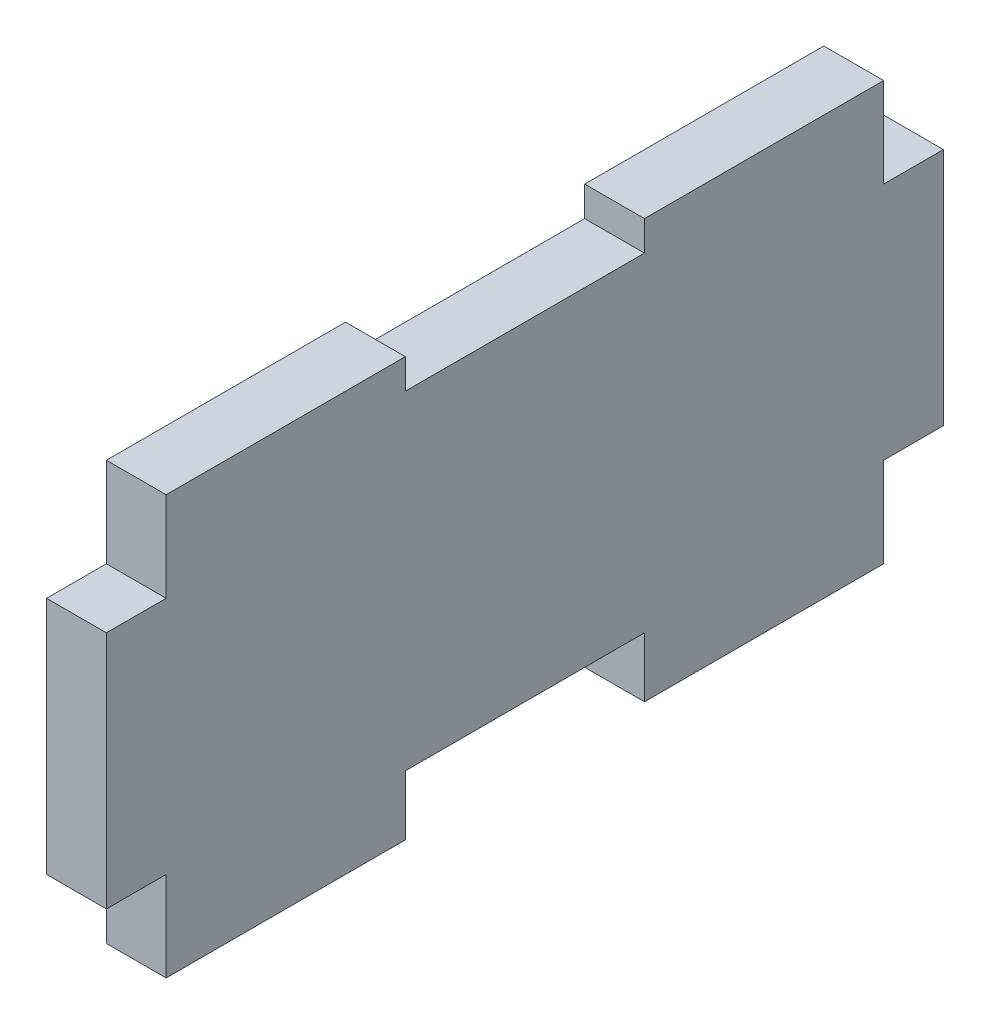
ISO-10303-21;
HEADER;
FILE_DESCRIPTION(('STEP AP214'),'2;1');
FILE_NAME('part.step','',(''),(''),'','','');
FILE_SCHEMA(('AUTOMOTIVE_DESIGN { 1 0 10303 214 1 1 1 1 }'));
ENDSEC;
DATA;
#1=APPLICATION_CONTEXT('core data for automotive mechanical design processes');
#2=APPLICATION_PROTOCOL_DEFINITION('international standard','automotive_design',2000,#1);
#3=PRODUCT_CONTEXT('',#1,'mechanical');
#4=PRODUCT('Part','Part','',(#3));
#5=PRODUCT_RELATED_PRODUCT_CATEGORY('part','',(#4));
#6=PRODUCT_DEFINITION_FORMATION('','',#4);
#7=PRODUCT_DEFINITION_CONTEXT('part definition',#1,'design');
#8=PRODUCT_DEFINITION('design','',#6,#7);
#9=PRODUCT_DEFINITION_SHAPE('','',#8);
#10=(LENGTH_UNIT() NAMED_UNIT(*) SI_UNIT(.MILLI.,.METRE.));
#11=(NAMED_UNIT(*) PLANE_ANGLE_UNIT() SI_UNIT($,.RADIAN.));
#12=(NAMED_UNIT(*) SI_UNIT($,.STERADIAN.) SOLID_ANGLE_UNIT());
#13=UNCERTAINTY_MEASURE_WITH_UNIT(LENGTH_MEASURE(1.E-05),#10,'distance_accuracy_value','');
#14=(GEOMETRIC_REPRESENTATION_CONTEXT(3) GLOBAL_UNCERTAINTY_ASSIGNED_CONTEXT((#13)) GLOBAL_UNIT_ASSIGNED_CONTEXT((#10,
#11,#12)) REPRESENTATION_CONTEXT('',''));
#15=CARTESIAN_POINT('',(0.,0.,0.));
#16=DIRECTION('',(0.,0.,1.));
#17=DIRECTION('',(1.,0.,0.));
#18=AXIS2_PLACEMENT_3D('',#15,#16,#17);
#19=CARTESIAN_POINT('',(10.,0.,50.));
#20=DIRECTION('',(0.,0.,1.));
#21=DIRECTION('',(1.,0.,0.));
#22=AXIS2_PLACEMENT_3D('',#19,#20,#21);
#23=PLANE('',#22);
#24=DIRECTION('',(0.,1.,0.));
#25=VECTOR('',#24,1.);
#26=CARTESIAN_POINT('',(0.,0.,50.));
#27=LINE('',#26,#25);
#28=CARTESIAN_POINT('',(0.,0.,50.));
#29=VERTEX_POINT('',#28);
#30=CARTESIAN_POINT('',(0.,10.,50.));
#31=VERTEX_POINT('',#30);
#32=EDGE_CURVE('E201',#29,#31,#27,.T.);
#33=ORIENTED_EDGE('',*,*,#32,.F.);
#34=DIRECTION('',(-1.,0.,0.));
#35=VECTOR('',#34,1.);
#36=CARTESIAN_POINT('',(10.,0.,50.));
#37=LINE('',#36,#35);
#38=CARTESIAN_POINT('',(10.,0.,50.));
#39=VERTEX_POINT('',#38);
#40=EDGE_CURVE('E11',#39,#29,#37,.T.);
#41=ORIENTED_EDGE('',*,*,#40,.F.);
#42=DIRECTION('',(0.,1.,0.));
#43=VECTOR('',#42,1.);
#44=CARTESIAN_POINT('',(10.,0.,50.));
#45=LINE('',#44,#43);
#46=CARTESIAN_POINT('',(10.,10.,50.));
#47=VERTEX_POINT('',#46);
#48=EDGE_CURVE('E251',#39,#47,#45,.T.);
#49=ORIENTED_EDGE('',*,*,#48,.T.);
#50=DIRECTION('',(-1.,0.,0.));
#51=VECTOR('',#50,1.);
#52=CARTESIAN_POINT('',(10.,10.,50.));
#53=LINE('',#52,#51);
#54=EDGE_CURVE('E122',#47,#31,#53,.T.);
#55=ORIENTED_EDGE('',*,*,#54,.T.);
#56=EDGE_LOOP('',(#33,#41,#49,#55));
#57=FACE_BOUND('',#56,.T.);
#58=ADVANCED_FACE('F35',(#57),#23,.T.);
#59=CARTESIAN_POINT('',(10.,0.,0.));
#60=DIRECTION('',(0.,1.,0.));
#61=DIRECTION('',(0.,0.,1.));
#62=AXIS2_PLACEMENT_3D('',#59,#60,#61);
#63=PLANE('',#62);
#64=DIRECTION('',(0.,0.,-1.));
#65=VECTOR('',#64,1.);
#66=CARTESIAN_POINT('',(0.,0.,0.));
#67=LINE('',#66,#65);
#68=CARTESIAN_POINT('',(0.,0.,10.));
#69=VERTEX_POINT('',#68);
#70=EDGE_CURVE('E204',#29,#69,#67,.T.);
#71=ORIENTED_EDGE('',*,*,#70,.T.);
#72=DIRECTION('',(-1.,0.,0.));
#73=VECTOR('',#72,1.);
#74=CARTESIAN_POINT('',(10.,0.,10.));
#75=LINE('',#74,#73);
#76=CARTESIAN_POINT('',(10.,0.,10.));
#77=VERTEX_POINT('',#76);
#78=EDGE_CURVE('E43',#77,#69,#75,.T.);
#79=ORIENTED_EDGE('',*,*,#78,.F.);
#80=DIRECTION('',(0.,0.,-1.));
#81=VECTOR('',#80,1.);
#82=CARTESIAN_POINT('',(10.,0.,0.));
#83=LINE('',#82,#81);
#84=EDGE_CURVE('E187',#39,#77,#83,.T.);
#85=ORIENTED_EDGE('',*,*,#84,.F.);
#86=ORIENTED_EDGE('',*,*,#40,.T.);
#87=EDGE_LOOP('',(#71,#79,#85,#86));
#88=FACE_BOUND('',#87,.T.);
#89=ADVANCED_FACE('F344',(#88),#63,.F.);
#90=CARTESIAN_POINT('',(10.,0.,10.));
#91=DIRECTION('',(0.,0.,1.));
#92=DIRECTION('',(1.,0.,0.));
#93=AXIS2_PLACEMENT_3D('',#90,#91,#92);
#94=PLANE('',#93);
#95=DIRECTION('',(0.,1.,0.));
#96=VECTOR('',#95,1.);
#97=CARTESIAN_POINT('',(0.,0.,10.));
#98=LINE('',#97,#96);
#99=CARTESIAN_POINT('',(0.,15.,10.));
#100=VERTEX_POINT('',#99);
#101=EDGE_CURVE('E206',#69,#100,#98,.T.);
#102=ORIENTED_EDGE('',*,*,#101,.T.);
#103=DIRECTION('',(-1.,0.,0.));
#104=VECTOR('',#103,1.);
#105=CARTESIAN_POINT('',(10.,15.,10.));
#106=LINE('',#105,#104);
#107=CARTESIAN_POINT('',(10.,15.,10.));
#108=VERTEX_POINT('',#107);
#109=EDGE_CURVE('E282',#108,#100,#106,.T.);
#110=ORIENTED_EDGE('',*,*,#109,.F.);
#111=DIRECTION('',(0.,1.,0.));
#112=VECTOR('',#111,1.);
#113=CARTESIAN_POINT('',(10.,0.,10.));
#114=LINE('',#113,#112);
#115=EDGE_CURVE('E290',#77,#108,#114,.T.);
#116=ORIENTED_EDGE('',*,*,#115,.F.);
#117=ORIENTED_EDGE('',*,*,#78,.T.);
#118=EDGE_LOOP('',(#102,#110,#116,#117));
#119=FACE_BOUND('',#118,.T.);
#120=ADVANCED_FACE('F288',(#119),#94,.F.);
#121=CARTESIAN_POINT('',(10.,15.,0.));
#122=DIRECTION('',(0.,-1.,0.));
#123=DIRECTION('',(0.,0.,-1.));
#124=AXIS2_PLACEMENT_3D('',#121,#122,#123);
#125=PLANE('',#124);
#126=DIRECTION('',(0.,0.,1.));
#127=VECTOR('',#126,1.);
#128=CARTESIAN_POINT('',(0.,15.,0.));
#129=LINE('',#128,#127);
#130=CARTESIAN_POINT('',(0.,15.,0.));
#131=VERTEX_POINT('',#130);
#132=EDGE_CURVE('E209',#131,#100,#129,.T.);
#133=ORIENTED_EDGE('',*,*,#132,.F.);
#134=DIRECTION('',(-1.,0.,0.));
#135=VECTOR('',#134,1.);
#136=CARTESIAN_POINT('',(10.,15.,0.));
#137=LINE('',#136,#135);
#138=CARTESIAN_POINT('',(10.,15.,0.));
#139=VERTEX_POINT('',#138);
#140=EDGE_CURVE('E280',#139,#131,#137,.T.);
#141=ORIENTED_EDGE('',*,*,#140,.F.);
#142=DIRECTION('',(0.,0.,1.));
#143=VECTOR('',#142,1.);
#144=CARTESIAN_POINT('',(10.,15.,0.));
#145=LINE('',#144,#143);
#146=EDGE_CURVE('E302',#139,#108,#145,.T.);
#147=ORIENTED_EDGE('',*,*,#146,.T.);
#148=ORIENTED_EDGE('',*,*,#109,.T.);
#149=EDGE_LOOP('',(#133,#141,#147,#148));
#150=FACE_BOUND('',#149,.T.);
#151=ADVANCED_FACE('F299',(#150),#125,.T.);
#152=CARTESIAN_POINT('',(10.,0.,0.));
#153=DIRECTION('',(0.,0.,-1.));
#154=DIRECTION('',(0.,1.,0.));
#155=AXIS2_PLACEMENT_3D('',#152,#153,#154);
#156=PLANE('',#155);
#157=DIRECTION('',(0.,-1.,0.));
#158=VECTOR('',#157,1.);
#159=CARTESIAN_POINT('',(0.,0.,0.));
#160=LINE('',#159,#158);
#161=CARTESIAN_POINT('',(0.,55.,0.));
#162=VERTEX_POINT('',#161);
#163=EDGE_CURVE('E212',#162,#131,#160,.T.);
#164=ORIENTED_EDGE('',*,*,#163,.F.);
#165=DIRECTION('',(-1.,0.,0.));
#166=VECTOR('',#165,1.);
#167=CARTESIAN_POINT('',(10.,55.,0.));
#168=LINE('',#167,#166);
#169=CARTESIAN_POINT('',(10.,55.,0.));
#170=VERTEX_POINT('',#169);
#171=EDGE_CURVE('E278',#170,#162,#168,.T.);
#172=ORIENTED_EDGE('',*,*,#171,.F.);
#173=DIRECTION('',(0.,-1.,0.));
#174=VECTOR('',#173,1.);
#175=CARTESIAN_POINT('',(10.,0.,0.));
#176=LINE('',#175,#174);
#177=EDGE_CURVE('E305',#170,#139,#176,.T.);
#178=ORIENTED_EDGE('',*,*,#177,.T.);
#179=ORIENTED_EDGE('',*,*,#140,.T.);
#180=EDGE_LOOP('',(#164,#172,#178,#179));
#181=FACE_BOUND('',#180,.T.);
#182=ADVANCED_FACE('F401',(#181),#156,.T.);
#183=CARTESIAN_POINT('',(10.,55.,0.));
#184=DIRECTION('',(0.,-1.,0.));
#185=DIRECTION('',(0.,0.,-1.));
#186=AXIS2_PLACEMENT_3D('',#183,#184,#185);
#187=PLANE('',#186);
#188=DIRECTION('',(0.,0.,1.));
#189=VECTOR('',#188,1.);
#190=CARTESIAN_POINT('',(0.,55.,0.));
#191=LINE('',#190,#189);
#192=CARTESIAN_POINT('',(0.,55.,10.));
#193=VERTEX_POINT('',#192);
#194=EDGE_CURVE('E215',#162,#193,#191,.T.);
#195=ORIENTED_EDGE('',*,*,#194,.T.);
#196=DIRECTION('',(-1.,0.,0.));
#197=VECTOR('',#196,1.);
#198=CARTESIAN_POINT('',(10.,55.,10.));
#199=LINE('',#198,#197);
#200=CARTESIAN_POINT('',(10.,55.,10.));
#201=VERTEX_POINT('',#200);
#202=EDGE_CURVE('E276',#201,#193,#199,.T.);
#203=ORIENTED_EDGE('',*,*,#202,.F.);
#204=DIRECTION('',(0.,0.,1.));
#205=VECTOR('',#204,1.);
#206=CARTESIAN_POINT('',(10.,55.,0.));
#207=LINE('',#206,#205);
#208=EDGE_CURVE('E307',#170,#201,#207,.T.);
#209=ORIENTED_EDGE('',*,*,#208,.F.);
#210=ORIENTED_EDGE('',*,*,#171,.T.);
#211=EDGE_LOOP('',(#195,#203,#209,#210));
#212=FACE_BOUND('',#211,.T.);
#213=ADVANCED_FACE('F397',(#212),#187,.F.);
#214=CARTESIAN_POINT('',(10.,0.,9.99999999999999));
#215=DIRECTION('',(0.,0.,-1.));
#216=DIRECTION('',(0.,1.,0.));
#217=AXIS2_PLACEMENT_3D('',#214,#215,#216);
#218=PLANE('',#217);
#219=DIRECTION('',(0.,-1.,0.));
#220=VECTOR('',#219,1.);
#221=CARTESIAN_POINT('',(0.,0.,9.99999999999999));
#222=LINE('',#221,#220);
#223=CARTESIAN_POINT('',(0.,70.,10.));
#224=VERTEX_POINT('',#223);
#225=EDGE_CURVE('E218',#224,#193,#222,.T.);
#226=ORIENTED_EDGE('',*,*,#225,.F.);
#227=DIRECTION('',(-1.,0.,0.));
#228=VECTOR('',#227,1.);
#229=CARTESIAN_POINT('',(10.,70.,10.));
#230=LINE('',#229,#228);
#231=CARTESIAN_POINT('',(10.,70.,10.));
#232=VERTEX_POINT('',#231);
#233=EDGE_CURVE('E274',#232,#224,#230,.T.);
#234=ORIENTED_EDGE('',*,*,#233,.F.);
#235=DIRECTION('',(0.,-1.,0.));
#236=VECTOR('',#235,1.);
#237=CARTESIAN_POINT('',(10.,0.,9.99999999999999));
#238=LINE('',#237,#236);
#239=EDGE_CURVE('E312',#232,#201,#238,.T.);
#240=ORIENTED_EDGE('',*,*,#239,.T.);
#241=ORIENTED_EDGE('',*,*,#202,.T.);
#242=EDGE_LOOP('',(#226,#234,#240,#241));
#243=FACE_BOUND('',#242,.T.);
#244=ADVANCED_FACE('F394',(#243),#218,.T.);
#245=CARTESIAN_POINT('',(10.,70.,0.));
#246=DIRECTION('',(0.,1.,0.));
#247=DIRECTION('',(0.,0.,1.));
#248=AXIS2_PLACEMENT_3D('',#245,#246,#247);
#249=PLANE('',#248);
#250=DIRECTION('',(0.,0.,-1.));
#251=VECTOR('',#250,1.);
#252=CARTESIAN_POINT('',(0.,70.,0.));
#253=LINE('',#252,#251);
#254=CARTESIAN_POINT('',(0.,70.,50.));
#255=VERTEX_POINT('',#254);
#256=EDGE_CURVE('E221',#255,#224,#253,.T.);
#257=ORIENTED_EDGE('',*,*,#256,.F.);
#258=DIRECTION('',(-1.,0.,0.));
#259=VECTOR('',#258,1.);
#260=CARTESIAN_POINT('',(10.,70.,50.));
#261=LINE('',#260,#259);
#262=CARTESIAN_POINT('',(10.,70.,50.));
#263=VERTEX_POINT('',#262);
#264=EDGE_CURVE('E272',#263,#255,#261,.T.);
#265=ORIENTED_EDGE('',*,*,#264,.F.);
#266=DIRECTION('',(0.,0.,-1.));
#267=VECTOR('',#266,1.);
#268=CARTESIAN_POINT('',(10.,70.,0.));
#269=LINE('',#268,#267);
#270=EDGE_CURVE('E315',#263,#232,#269,.T.);
#271=ORIENTED_EDGE('',*,*,#270,.T.);
#272=ORIENTED_EDGE('',*,*,#233,.T.);
#273=EDGE_LOOP('',(#257,#265,#271,#272));
#274=FACE_BOUND('',#273,.T.);
#275=ADVANCED_FACE('F382',(#274),#249,.T.);
#276=CARTESIAN_POINT('',(10.,0.,50.));
#277=DIRECTION('',(0.,0.,-1.));
#278=DIRECTION('',(-1.,0.,0.));
#279=AXIS2_PLACEMENT_3D('',#276,#277,#278);
#280=PLANE('',#279);
#281=DIRECTION('',(0.,-1.,0.));
#282=VECTOR('',#281,1.);
#283=CARTESIAN_POINT('',(0.,0.,50.));
#284=LINE('',#283,#282);
#285=CARTESIAN_POINT('',(0.,65.,50.));
#286=VERTEX_POINT('',#285);
#287=EDGE_CURVE('E224',#255,#286,#284,.T.);
#288=ORIENTED_EDGE('',*,*,#287,.T.);
#289=DIRECTION('',(-1.,0.,0.));
#290=VECTOR('',#289,1.);
#291=CARTESIAN_POINT('',(10.,65.,50.));
#292=LINE('',#291,#290);
#293=CARTESIAN_POINT('',(10.,65.,50.));
#294=VERTEX_POINT('',#293);
#295=EDGE_CURVE('E270',#294,#286,#292,.T.);
#296=ORIENTED_EDGE('',*,*,#295,.F.);
#297=DIRECTION('',(0.,-1.,0.));
#298=VECTOR('',#297,1.);
#299=CARTESIAN_POINT('',(10.,0.,50.));
#300=LINE('',#299,#298);
#301=EDGE_CURVE('E318',#263,#294,#300,.T.);
#302=ORIENTED_EDGE('',*,*,#301,.F.);
#303=ORIENTED_EDGE('',*,*,#264,.T.);
#304=EDGE_LOOP('',(#288,#296,#302,#303));
#305=FACE_BOUND('',#304,.T.);
#306=ADVANCED_FACE('F389',(#305),#280,.F.);
#307=CARTESIAN_POINT('',(10.,65.,0.));
#308=DIRECTION('',(0.,1.,0.));
#309=DIRECTION('',(0.,0.,1.));
#310=AXIS2_PLACEMENT_3D('',#307,#308,#309);
#311=PLANE('',#310);
#312=DIRECTION('',(0.,0.,-1.));
#313=VECTOR('',#312,1.);
#314=CARTESIAN_POINT('',(0.,65.,0.));
#315=LINE('',#314,#313);
#316=CARTESIAN_POINT('',(0.,65.,90.));
#317=VERTEX_POINT('',#316);
#318=EDGE_CURVE('E228',#317,#286,#315,.T.);
#319=ORIENTED_EDGE('',*,*,#318,.F.);
#320=DIRECTION('',(-1.,0.,0.));
#321=VECTOR('',#320,1.);
#322=CARTESIAN_POINT('',(10.,65.,90.));
#323=LINE('',#322,#321);
#324=CARTESIAN_POINT('',(10.,65.,90.));
#325=VERTEX_POINT('',#324);
#326=EDGE_CURVE('E268',#325,#317,#323,.T.);
#327=ORIENTED_EDGE('',*,*,#326,.F.);
#328=DIRECTION('',(0.,0.,-1.));
#329=VECTOR('',#328,1.);
#330=CARTESIAN_POINT('',(10.,65.,0.));
#331=LINE('',#330,#329);
#332=EDGE_CURVE('E321',#325,#294,#331,.T.);
#333=ORIENTED_EDGE('',*,*,#332,.T.);
#334=ORIENTED_EDGE('',*,*,#295,.T.);
#335=EDGE_LOOP('',(#319,#327,#333,#334));
#336=FACE_BOUND('',#335,.T.);
#337=ADVANCED_FACE('F385',(#336),#311,.T.);
#338=CARTESIAN_POINT('',(10.,0.,90.));
#339=DIRECTION('',(0.,0.,-1.));
#340=DIRECTION('',(-1.,0.,0.));
#341=AXIS2_PLACEMENT_3D('',#338,#339,#340);
#342=PLANE('',#341);
#343=DIRECTION('',(0.,-1.,0.));
#344=VECTOR('',#343,1.);
#345=CARTESIAN_POINT('',(0.,0.,90.));
#346=LINE('',#345,#344);
#347=CARTESIAN_POINT('',(0.,70.,90.));
#348=VERTEX_POINT('',#347);
#349=EDGE_CURVE('E231',#348,#317,#346,.T.);
#350=ORIENTED_EDGE('',*,*,#349,.F.);
#351=DIRECTION('',(-1.,0.,0.));
#352=VECTOR('',#351,1.);
#353=CARTESIAN_POINT('',(10.,70.,90.));
#354=LINE('',#353,#352);
#355=CARTESIAN_POINT('',(10.,70.,90.));
#356=VERTEX_POINT('',#355);
#357=EDGE_CURVE('E266',#356,#348,#354,.T.);
#358=ORIENTED_EDGE('',*,*,#357,.F.);
#359=DIRECTION('',(0.,-1.,0.));
#360=VECTOR('',#359,1.);
#361=CARTESIAN_POINT('',(10.,0.,90.));
#362=LINE('',#361,#360);
#363=EDGE_CURVE('E324',#356,#325,#362,.T.);
#364=ORIENTED_EDGE('',*,*,#363,.T.);
#365=ORIENTED_EDGE('',*,*,#326,.T.);
#366=EDGE_LOOP('',(#350,#358,#364,#365));
#367=FACE_BOUND('',#366,.T.);
#368=ADVANCED_FACE('F380',(#367),#342,.T.);
#369=CARTESIAN_POINT('',(0.,70.,130.));
#370=VERTEX_POINT('',#369);
#371=EDGE_CURVE('E225',#370,#348,#253,.T.);
#372=ORIENTED_EDGE('',*,*,#371,.F.);
#373=DIRECTION('',(-1.,0.,0.));
#374=VECTOR('',#373,1.);
#375=CARTESIAN_POINT('',(10.,70.,130.));
#376=LINE('',#375,#374);
#377=CARTESIAN_POINT('',(10.,70.,130.));
#378=VERTEX_POINT('',#377);
#379=EDGE_CURVE('E264',#378,#370,#376,.T.);
#380=ORIENTED_EDGE('',*,*,#379,.F.);
#381=EDGE_CURVE('E319',#378,#356,#269,.T.);
#382=ORIENTED_EDGE('',*,*,#381,.T.);
#383=ORIENTED_EDGE('',*,*,#357,.T.);
#384=EDGE_LOOP('',(#372,#380,#382,#383));
#385=FACE_BOUND('',#384,.T.);
#386=ADVANCED_FACE('F376',(#385),#249,.T.);
#387=CARTESIAN_POINT('',(10.,2.40548322002118E-13,130.));
#388=DIRECTION('',(0.,0.,-1.));
#389=DIRECTION('',(0.,1.,0.));
#390=AXIS2_PLACEMENT_3D('',#387,#388,#389);
#391=PLANE('',#390);
#392=DIRECTION('',(0.,-1.,0.));
#393=VECTOR('',#392,1.);
#394=CARTESIAN_POINT('',(0.,2.40548322002118E-13,130.));
#395=LINE('',#394,#393);
#396=CARTESIAN_POINT('',(0.,55.,130.));
#397=VERTEX_POINT('',#396);
#398=EDGE_CURVE('E234',#370,#397,#395,.T.);
#399=ORIENTED_EDGE('',*,*,#398,.T.);
#400=DIRECTION('',(-1.,0.,0.));
#401=VECTOR('',#400,1.);
#402=CARTESIAN_POINT('',(10.,55.,130.));
#403=LINE('',#402,#401);
#404=CARTESIAN_POINT('',(10.,55.,130.));
#405=VERTEX_POINT('',#404);
#406=EDGE_CURVE('E262',#405,#397,#403,.T.);
#407=ORIENTED_EDGE('',*,*,#406,.F.);
#408=DIRECTION('',(0.,-1.,0.));
#409=VECTOR('',#408,1.);
#410=CARTESIAN_POINT('',(10.,2.40548322002118E-13,130.));
#411=LINE('',#410,#409);
#412=EDGE_CURVE('E327',#378,#405,#411,.T.);
#413=ORIENTED_EDGE('',*,*,#412,.F.);
#414=ORIENTED_EDGE('',*,*,#379,.T.);
#415=EDGE_LOOP('',(#399,#407,#413,#414));
#416=FACE_BOUND('',#415,.T.);
#417=ADVANCED_FACE('F372',(#416),#391,.F.);
#418=CARTESIAN_POINT('',(10.,55.,0.));
#419=DIRECTION('',(0.,1.,0.));
#420=DIRECTION('',(0.,0.,1.));
#421=AXIS2_PLACEMENT_3D('',#418,#419,#420);
#422=PLANE('',#421);
#423=DIRECTION('',(0.,0.,-1.));
#424=VECTOR('',#423,1.);
#425=CARTESIAN_POINT('',(0.,55.,0.));
#426=LINE('',#425,#424);
#427=CARTESIAN_POINT('',(0.,55.,140.));
#428=VERTEX_POINT('',#427);
#429=EDGE_CURVE('E237',#428,#397,#426,.T.);
#430=ORIENTED_EDGE('',*,*,#429,.F.);
#431=DIRECTION('',(-1.,0.,0.));
#432=VECTOR('',#431,1.);
#433=CARTESIAN_POINT('',(10.,55.,140.));
#434=LINE('',#433,#432);
#435=CARTESIAN_POINT('',(10.,55.,140.));
#436=VERTEX_POINT('',#435);
#437=EDGE_CURVE('E260',#436,#428,#434,.T.);
#438=ORIENTED_EDGE('',*,*,#437,.F.);
#439=DIRECTION('',(0.,0.,-1.));
#440=VECTOR('',#439,1.);
#441=CARTESIAN_POINT('',(10.,55.,0.));
#442=LINE('',#441,#440);
#443=EDGE_CURVE('E329',#436,#405,#442,.T.);
#444=ORIENTED_EDGE('',*,*,#443,.T.);
#445=ORIENTED_EDGE('',*,*,#406,.T.);
#446=EDGE_LOOP('',(#430,#438,#444,#445));
#447=FACE_BOUND('',#446,.T.);
#448=ADVANCED_FACE('F368',(#447),#422,.T.);
#449=CARTESIAN_POINT('',(10.,0.,140.));
#450=DIRECTION('',(0.,0.,-1.));
#451=DIRECTION('',(-1.,0.,0.));
#452=AXIS2_PLACEMENT_3D('',#449,#450,#451);
#453=PLANE('',#452);
#454=DIRECTION('',(0.,-1.,0.));
#455=VECTOR('',#454,1.);
#456=CARTESIAN_POINT('',(0.,0.,140.));
#457=LINE('',#456,#455);
#458=CARTESIAN_POINT('',(0.,15.,140.));
#459=VERTEX_POINT('',#458);
#460=EDGE_CURVE('E240',#428,#459,#457,.T.);
#461=ORIENTED_EDGE('',*,*,#460,.T.);
#462=DIRECTION('',(-1.,0.,0.));
#463=VECTOR('',#462,1.);
#464=CARTESIAN_POINT('',(10.,15.,140.));
#465=LINE('',#464,#463);
#466=CARTESIAN_POINT('',(10.,15.,140.));
#467=VERTEX_POINT('',#466);
#468=EDGE_CURVE('E257',#467,#459,#465,.T.);
#469=ORIENTED_EDGE('',*,*,#468,.F.);
#470=DIRECTION('',(0.,-1.,0.));
#471=VECTOR('',#470,1.);
#472=CARTESIAN_POINT('',(10.,0.,140.));
#473=LINE('',#472,#471);
#474=EDGE_CURVE('E332',#436,#467,#473,.T.);
#475=ORIENTED_EDGE('',*,*,#474,.F.);
#476=ORIENTED_EDGE('',*,*,#437,.T.);
#477=EDGE_LOOP('',(#461,#469,#475,#476));
#478=FACE_BOUND('',#477,.T.);
#479=ADVANCED_FACE('F362',(#478),#453,.F.);
#480=CARTESIAN_POINT('',(10.,15.,0.));
#481=DIRECTION('',(0.,1.,0.));
#482=DIRECTION('',(0.,0.,1.));
#483=AXIS2_PLACEMENT_3D('',#480,#481,#482);
#484=PLANE('',#483);
#485=DIRECTION('',(0.,0.,-1.));
#486=VECTOR('',#485,1.);
#487=CARTESIAN_POINT('',(0.,15.,0.));
#488=LINE('',#487,#486);
#489=CARTESIAN_POINT('',(0.,15.,130.));
#490=VERTEX_POINT('',#489);
#491=EDGE_CURVE('E242',#459,#490,#488,.T.);
#492=ORIENTED_EDGE('',*,*,#491,.T.);
#493=DIRECTION('',(-1.,0.,0.));
#494=VECTOR('',#493,1.);
#495=CARTESIAN_POINT('',(10.,15.,130.));
#496=LINE('',#495,#494);
#497=CARTESIAN_POINT('',(10.,15.,130.));
#498=VERTEX_POINT('',#497);
#499=EDGE_CURVE('E255',#498,#490,#496,.T.);
#500=ORIENTED_EDGE('',*,*,#499,.F.);
#501=DIRECTION('',(0.,0.,-1.));
#502=VECTOR('',#501,1.);
#503=CARTESIAN_POINT('',(10.,15.,0.));
#504=LINE('',#503,#502);
#505=EDGE_CURVE('E333',#467,#498,#504,.T.);
#506=ORIENTED_EDGE('',*,*,#505,.F.);
#507=ORIENTED_EDGE('',*,*,#468,.T.);
#508=EDGE_LOOP('',(#492,#500,#506,#507));
#509=FACE_BOUND('',#508,.T.);
#510=ADVANCED_FACE('F358',(#509),#484,.F.);
#511=CARTESIAN_POINT('',(10.,0.,130.));
#512=DIRECTION('',(0.,0.,1.));
#513=DIRECTION('',(1.,0.,0.));
#514=AXIS2_PLACEMENT_3D('',#511,#512,#513);
#515=PLANE('',#514);
#516=DIRECTION('',(0.,1.,0.));
#517=VECTOR('',#516,1.);
#518=CARTESIAN_POINT('',(0.,0.,130.));
#519=LINE('',#518,#517);
#520=CARTESIAN_POINT('',(0.,0.,130.));
#521=VERTEX_POINT('',#520);
#522=EDGE_CURVE('E245',#521,#490,#519,.T.);
#523=ORIENTED_EDGE('',*,*,#522,.F.);
#524=DIRECTION('',(-1.,0.,0.));
#525=VECTOR('',#524,1.);
#526=CARTESIAN_POINT('',(10.,0.,130.));
#527=LINE('',#526,#525);
#528=CARTESIAN_POINT('',(10.,0.,130.));
#529=VERTEX_POINT('',#528);
#530=EDGE_CURVE('E192',#529,#521,#527,.T.);
#531=ORIENTED_EDGE('',*,*,#530,.F.);
#532=DIRECTION('',(0.,1.,0.));
#533=VECTOR('',#532,1.);
#534=CARTESIAN_POINT('',(10.,0.,130.));
#535=LINE('',#534,#533);
#536=EDGE_CURVE('E184',#529,#498,#535,.T.);
#537=ORIENTED_EDGE('',*,*,#536,.T.);
#538=ORIENTED_EDGE('',*,*,#499,.T.);
#539=EDGE_LOOP('',(#523,#531,#537,#538));
#540=FACE_BOUND('',#539,.T.);
#541=ADVANCED_FACE('F338',(#540),#515,.T.);
#542=CARTESIAN_POINT('',(0.,0.,90.));
#543=VERTEX_POINT('',#542);
#544=EDGE_CURVE('E191',#521,#543,#67,.T.);
#545=ORIENTED_EDGE('',*,*,#544,.T.);
#546=DIRECTION('',(-1.,0.,0.));
#547=VECTOR('',#546,1.);
#548=CARTESIAN_POINT('',(10.,0.,90.));
#549=LINE('',#548,#547);
#550=CARTESIAN_POINT('',(10.,0.,90.));
#551=VERTEX_POINT('',#550);
#552=EDGE_CURVE('E188',#551,#543,#549,.T.);
#553=ORIENTED_EDGE('',*,*,#552,.F.);
#554=EDGE_CURVE('E178',#529,#551,#83,.T.);
#555=ORIENTED_EDGE('',*,*,#554,.F.);
#556=ORIENTED_EDGE('',*,*,#530,.T.);
#557=EDGE_LOOP('',(#545,#553,#555,#556));
#558=FACE_BOUND('',#557,.T.);
#559=ADVANCED_FACE('F189',(#558),#63,.F.);
#560=CARTESIAN_POINT('',(10.,0.,90.));
#561=DIRECTION('',(0.,0.,1.));
#562=DIRECTION('',(1.,0.,0.));
#563=AXIS2_PLACEMENT_3D('',#560,#561,#562);
#564=PLANE('',#563);
#565=DIRECTION('',(0.,1.,0.));
#566=VECTOR('',#565,1.);
#567=CARTESIAN_POINT('',(0.,0.,90.));
#568=LINE('',#567,#566);
#569=CARTESIAN_POINT('',(0.,10.,90.));
#570=VERTEX_POINT('',#569);
#571=EDGE_CURVE('E115',#543,#570,#568,.T.);
#572=ORIENTED_EDGE('',*,*,#571,.T.);
#573=DIRECTION('',(-1.,0.,0.));
#574=VECTOR('',#573,1.);
#575=CARTESIAN_POINT('',(10.,10.,90.));
#576=LINE('',#575,#574);
#577=CARTESIAN_POINT('',(10.,10.,90.));
#578=VERTEX_POINT('',#577);
#579=EDGE_CURVE('E193',#578,#570,#576,.T.);
#580=ORIENTED_EDGE('',*,*,#579,.F.);
#581=DIRECTION('',(0.,1.,0.));
#582=VECTOR('',#581,1.);
#583=CARTESIAN_POINT('',(10.,0.,90.));
#584=LINE('',#583,#582);
#585=EDGE_CURVE('E182',#551,#578,#584,.T.);
#586=ORIENTED_EDGE('',*,*,#585,.F.);
#587=ORIENTED_EDGE('',*,*,#552,.T.);
#588=EDGE_LOOP('',(#572,#580,#586,#587));
#589=FACE_BOUND('',#588,.T.);
#590=ADVANCED_FACE('F195',(#589),#564,.F.);
#591=CARTESIAN_POINT('',(10.,10.,0.));
#592=DIRECTION('',(0.,1.,0.));
#593=DIRECTION('',(0.,0.,1.));
#594=AXIS2_PLACEMENT_3D('',#591,#592,#593);
#595=PLANE('',#594);
#596=DIRECTION('',(0.,0.,-1.));
#597=VECTOR('',#596,1.);
#598=CARTESIAN_POINT('',(0.,10.,0.));
#599=LINE('',#598,#597);
#600=EDGE_CURVE('E249',#570,#31,#599,.T.);
#601=ORIENTED_EDGE('',*,*,#600,.T.);
#602=ORIENTED_EDGE('',*,*,#54,.F.);
#603=DIRECTION('',(0.,0.,-1.));
#604=VECTOR('',#603,1.);
#605=CARTESIAN_POINT('',(10.,10.,0.));
#606=LINE('',#605,#604);
#607=EDGE_CURVE('E51',#578,#47,#606,.T.);
#608=ORIENTED_EDGE('',*,*,#607,.F.);
#609=ORIENTED_EDGE('',*,*,#579,.T.);
#610=EDGE_LOOP('',(#601,#602,#608,#609));
#611=FACE_BOUND('',#610,.T.);
#612=ADVANCED_FACE('F342',(#611),#595,.F.);
#613=CARTESIAN_POINT('',(10.,0.,0.));
#614=DIRECTION('',(1.,0.,0.));
#615=DIRECTION('',(0.,0.,-1.));
#616=AXIS2_PLACEMENT_3D('',#613,#614,#615);
#617=PLANE('',#616);
#618=ORIENTED_EDGE('',*,*,#48,.F.);
#619=ORIENTED_EDGE('',*,*,#84,.T.);
#620=ORIENTED_EDGE('',*,*,#115,.T.);
#621=ORIENTED_EDGE('',*,*,#146,.F.);
#622=ORIENTED_EDGE('',*,*,#177,.F.);
#623=ORIENTED_EDGE('',*,*,#208,.T.);
#624=ORIENTED_EDGE('',*,*,#239,.F.);
#625=ORIENTED_EDGE('',*,*,#270,.F.);
#626=ORIENTED_EDGE('',*,*,#301,.T.);
#627=ORIENTED_EDGE('',*,*,#332,.F.);
#628=ORIENTED_EDGE('',*,*,#363,.F.);
#629=ORIENTED_EDGE('',*,*,#381,.F.);
#630=ORIENTED_EDGE('',*,*,#412,.T.);
#631=ORIENTED_EDGE('',*,*,#443,.F.);
#632=ORIENTED_EDGE('',*,*,#474,.T.);
#633=ORIENTED_EDGE('',*,*,#505,.T.);
#634=ORIENTED_EDGE('',*,*,#536,.F.);
#635=ORIENTED_EDGE('',*,*,#554,.T.);
#636=ORIENTED_EDGE('',*,*,#585,.T.);
#637=ORIENTED_EDGE('',*,*,#607,.T.);
#638=EDGE_LOOP('',(#618,#619,#620,#621,#622,#623,#624,#625,#626,#627,#628,#629,#630,#631,#632,
#633,#634,#635,#636,#637));
#639=FACE_BOUND('',#638,.T.);
#640=ADVANCED_FACE('F180',(#639),#617,.T.);
#641=CARTESIAN_POINT('',(0.,0.,0.));
#642=DIRECTION('',(1.,0.,0.));
#643=DIRECTION('',(0.,0.,-1.));
#644=AXIS2_PLACEMENT_3D('',#641,#642,#643);
#645=PLANE('',#644);
#646=ORIENTED_EDGE('',*,*,#32,.T.);
#647=ORIENTED_EDGE('',*,*,#600,.F.);
#648=ORIENTED_EDGE('',*,*,#571,.F.);
#649=ORIENTED_EDGE('',*,*,#544,.F.);
#650=ORIENTED_EDGE('',*,*,#522,.T.);
#651=ORIENTED_EDGE('',*,*,#491,.F.);
#652=ORIENTED_EDGE('',*,*,#460,.F.);
#653=ORIENTED_EDGE('',*,*,#429,.T.);
#654=ORIENTED_EDGE('',*,*,#398,.F.);
#655=ORIENTED_EDGE('',*,*,#371,.T.);
#656=ORIENTED_EDGE('',*,*,#349,.T.);
#657=ORIENTED_EDGE('',*,*,#318,.T.);
#658=ORIENTED_EDGE('',*,*,#287,.F.);
#659=ORIENTED_EDGE('',*,*,#256,.T.);
#660=ORIENTED_EDGE('',*,*,#225,.T.);
#661=ORIENTED_EDGE('',*,*,#194,.F.);
#662=ORIENTED_EDGE('',*,*,#163,.T.);
#663=ORIENTED_EDGE('',*,*,#132,.T.);
#664=ORIENTED_EDGE('',*,*,#101,.F.);
#665=ORIENTED_EDGE('',*,*,#70,.F.);
#666=EDGE_LOOP('',(#646,#647,#648,#649,#650,#651,#652,#653,#654,#655,#656,#657,#658,#659,#660,
#661,#662,#663,#664,#665));
#667=FACE_BOUND('',#666,.T.);
#668=ADVANCED_FACE('F294',(#667),#645,.F.);
#669=CLOSED_SHELL('',(#58,#89,#120,#151,#182,#213,#244,#275,#306,#337,#368,#386,#417,#448,#479,
#510,#541,#559,#590,#612,#640,#668));
#670=MANIFOLD_SOLID_BREP('B2',#669);
#671=ADVANCED_BREP_SHAPE_REPRESENTATION('',(#18,#670),#14);
#672=SHAPE_DEFINITION_REPRESENTATION(#9,#671);
ENDSEC;
END-ISO-10303-21;
